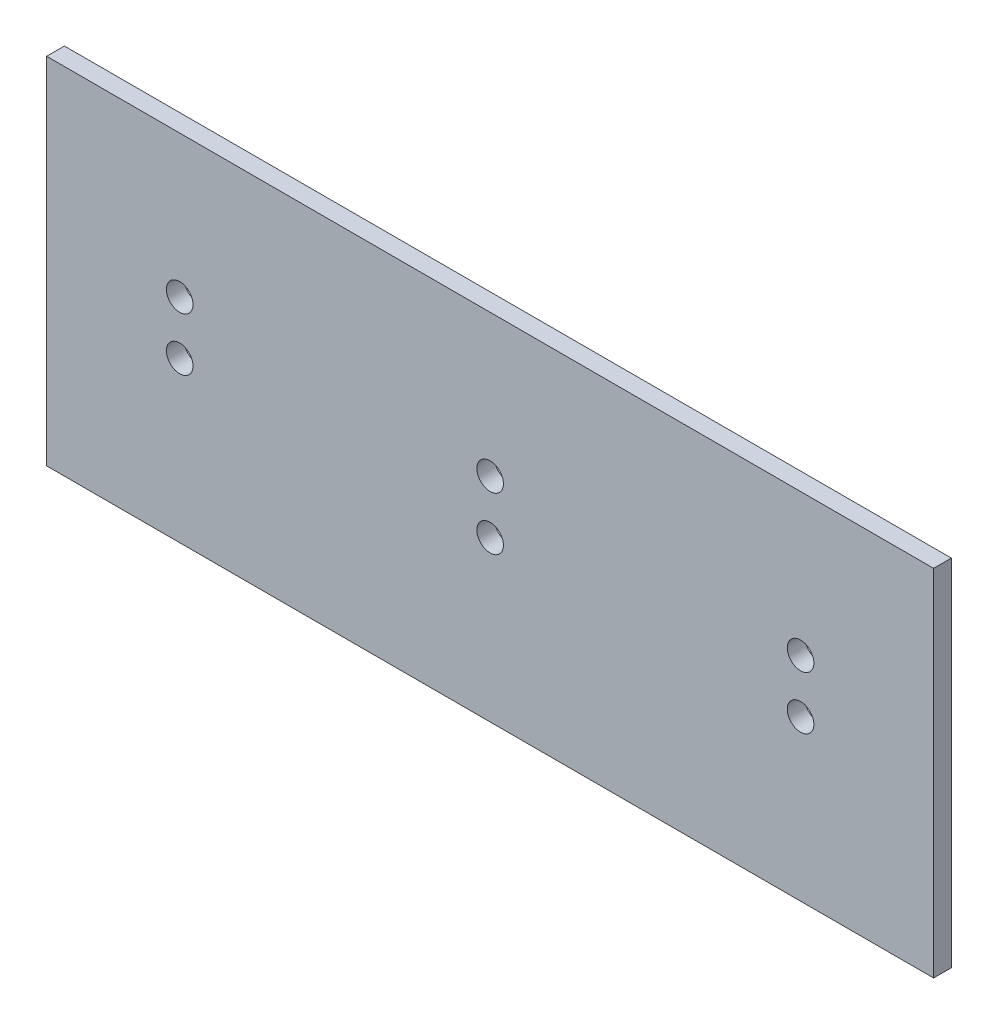
ISO-10303-21;
HEADER;
FILE_DESCRIPTION(('STEP AP214'),'2;1');
FILE_NAME('part.step','',(''),(''),'','','');
FILE_SCHEMA(('AUTOMOTIVE_DESIGN { 1 0 10303 214 1 1 1 1 }'));
ENDSEC;
DATA;
#1=APPLICATION_CONTEXT('core data for automotive mechanical design processes');
#2=APPLICATION_PROTOCOL_DEFINITION('international standard','automotive_design',2000,#1);
#3=PRODUCT_CONTEXT('',#1,'mechanical');
#4=PRODUCT('Part','Part','',(#3));
#5=PRODUCT_RELATED_PRODUCT_CATEGORY('part','',(#4));
#6=PRODUCT_DEFINITION_FORMATION('','',#4);
#7=PRODUCT_DEFINITION_CONTEXT('part definition',#1,'design');
#8=PRODUCT_DEFINITION('design','',#6,#7);
#9=PRODUCT_DEFINITION_SHAPE('','',#8);
#10=(LENGTH_UNIT() NAMED_UNIT(*) SI_UNIT(.MILLI.,.METRE.));
#11=(NAMED_UNIT(*) PLANE_ANGLE_UNIT() SI_UNIT($,.RADIAN.));
#12=(NAMED_UNIT(*) SI_UNIT($,.STERADIAN.) SOLID_ANGLE_UNIT());
#13=UNCERTAINTY_MEASURE_WITH_UNIT(LENGTH_MEASURE(1.E-05),#10,'distance_accuracy_value','');
#14=(GEOMETRIC_REPRESENTATION_CONTEXT(3) GLOBAL_UNCERTAINTY_ASSIGNED_CONTEXT((#13)) GLOBAL_UNIT_ASSIGNED_CONTEXT((#10,
#11,#12)) REPRESENTATION_CONTEXT('',''));
#15=CARTESIAN_POINT('',(0.,0.,0.));
#16=DIRECTION('',(0.,0.,1.));
#17=DIRECTION('',(1.,0.,0.));
#18=AXIS2_PLACEMENT_3D('',#15,#16,#17);
#19=CARTESIAN_POINT('',(0.,0.,2.));
#20=DIRECTION('',(0.,0.,1.));
#21=DIRECTION('',(1.,0.,0.));
#22=AXIS2_PLACEMENT_3D('',#19,#20,#21);
#23=PLANE('',#22);
#24=CARTESIAN_POINT('',(35.,-2.,2.));
#25=DIRECTION('',(0.,0.,1.));
#26=DIRECTION('',(-1.,0.,0.));
#27=AXIS2_PLACEMENT_3D('',#24,#25,#26);
#28=CIRCLE('',#27,1.5);
#29=CARTESIAN_POINT('',(33.5,-2.,2.));
#30=VERTEX_POINT('',#29);
#31=EDGE_CURVE('E137',#30,#30,#28,.T.);
#32=ORIENTED_EDGE('',*,*,#31,.F.);
#33=EDGE_LOOP('',(#32));
#34=FACE_BOUND('',#33,.T.);
#35=CARTESIAN_POINT('',(35.,4.,2.));
#36=DIRECTION('',(0.,0.,1.));
#37=DIRECTION('',(-1.,0.,0.));
#38=AXIS2_PLACEMENT_3D('',#35,#36,#37);
#39=CIRCLE('',#38,1.5);
#40=CARTESIAN_POINT('',(33.5,4.,2.));
#41=VERTEX_POINT('',#40);
#42=EDGE_CURVE('E125',#41,#41,#39,.T.);
#43=ORIENTED_EDGE('',*,*,#42,.F.);
#44=EDGE_LOOP('',(#43));
#45=FACE_BOUND('',#44,.T.);
#46=CARTESIAN_POINT('',(-35.,-2.00000000000001,2.));
#47=DIRECTION('',(0.,0.,1.));
#48=DIRECTION('',(1.,0.,0.));
#49=AXIS2_PLACEMENT_3D('',#46,#47,#48);
#50=CIRCLE('',#49,1.5);
#51=CARTESIAN_POINT('',(-33.5,-2.00000000000001,2.));
#52=VERTEX_POINT('',#51);
#53=EDGE_CURVE('E104',#52,#52,#50,.T.);
#54=ORIENTED_EDGE('',*,*,#53,.F.);
#55=EDGE_LOOP('',(#54));
#56=FACE_BOUND('',#55,.T.);
#57=DIRECTION('',(0.,1.,0.));
#58=VECTOR('',#57,1.);
#59=CARTESIAN_POINT('',(50.,20.,2.));
#60=LINE('',#59,#58);
#61=CARTESIAN_POINT('',(50.,-20.,2.));
#62=VERTEX_POINT('',#61);
#63=CARTESIAN_POINT('',(50.,20.,2.));
#64=VERTEX_POINT('',#63);
#65=EDGE_CURVE('E89',#62,#64,#60,.T.);
#66=ORIENTED_EDGE('',*,*,#65,.T.);
#67=DIRECTION('',(-1.,0.,0.));
#68=VECTOR('',#67,1.);
#69=CARTESIAN_POINT('',(-50.,20.,2.));
#70=LINE('',#69,#68);
#71=CARTESIAN_POINT('',(-50.,20.,2.));
#72=VERTEX_POINT('',#71);
#73=EDGE_CURVE('E84',#64,#72,#70,.T.);
#74=ORIENTED_EDGE('',*,*,#73,.T.);
#75=DIRECTION('',(0.,-1.,0.));
#76=VECTOR('',#75,1.);
#77=CARTESIAN_POINT('',(-50.,20.,2.));
#78=LINE('',#77,#76);
#79=CARTESIAN_POINT('',(-50.,-20.,2.));
#80=VERTEX_POINT('',#79);
#81=EDGE_CURVE('E87',#72,#80,#78,.T.);
#82=ORIENTED_EDGE('',*,*,#81,.T.);
#83=DIRECTION('',(1.,0.,0.));
#84=VECTOR('',#83,1.);
#85=CARTESIAN_POINT('',(-50.,-20.,2.));
#86=LINE('',#85,#84);
#87=EDGE_CURVE('E54',#80,#62,#86,.T.);
#88=ORIENTED_EDGE('',*,*,#87,.T.);
#89=EDGE_LOOP('',(#66,#74,#82,#88));
#90=FACE_BOUND('',#89,.T.);
#91=CARTESIAN_POINT('',(0.,4.,2.));
#92=DIRECTION('',(0.,0.,1.));
#93=DIRECTION('',(1.,0.,0.));
#94=AXIS2_PLACEMENT_3D('',#91,#92,#93);
#95=CIRCLE('',#94,1.5);
#96=CARTESIAN_POINT('',(1.5,4.,2.));
#97=VERTEX_POINT('',#96);
#98=EDGE_CURVE('E119',#97,#97,#95,.T.);
#99=ORIENTED_EDGE('',*,*,#98,.F.);
#100=EDGE_LOOP('',(#99));
#101=FACE_BOUND('',#100,.T.);
#102=CARTESIAN_POINT('',(-35.,3.99999999999999,2.));
#103=DIRECTION('',(0.,0.,1.));
#104=DIRECTION('',(1.,0.,0.));
#105=AXIS2_PLACEMENT_3D('',#102,#103,#104);
#106=CIRCLE('',#105,1.5);
#107=CARTESIAN_POINT('',(-33.5,3.99999999999999,2.));
#108=VERTEX_POINT('',#107);
#109=EDGE_CURVE('E131',#108,#108,#106,.T.);
#110=ORIENTED_EDGE('',*,*,#109,.F.);
#111=EDGE_LOOP('',(#110));
#112=FACE_BOUND('',#111,.T.);
#113=CARTESIAN_POINT('',(0.,-2.00000000000001,2.));
#114=DIRECTION('',(0.,0.,1.));
#115=DIRECTION('',(1.,0.,0.));
#116=AXIS2_PLACEMENT_3D('',#113,#114,#115);
#117=CIRCLE('',#116,1.5);
#118=CARTESIAN_POINT('',(1.5,-2.00000000000001,2.));
#119=VERTEX_POINT('',#118);
#120=EDGE_CURVE('E143',#119,#119,#117,.T.);
#121=ORIENTED_EDGE('',*,*,#120,.F.);
#122=EDGE_LOOP('',(#121));
#123=FACE_BOUND('',#122,.T.);
#124=ADVANCED_FACE('F37',(#34,#45,#56,#90,#101,#112,#123),#23,.T.);
#125=CARTESIAN_POINT('',(0.,0.,0.));
#126=DIRECTION('',(0.,0.,1.));
#127=DIRECTION('',(1.,0.,0.));
#128=AXIS2_PLACEMENT_3D('',#125,#126,#127);
#129=PLANE('',#128);
#130=DIRECTION('',(0.,1.,0.));
#131=VECTOR('',#130,1.);
#132=CARTESIAN_POINT('',(50.,20.,0.));
#133=LINE('',#132,#131);
#134=CARTESIAN_POINT('',(50.,-20.,0.));
#135=VERTEX_POINT('',#134);
#136=CARTESIAN_POINT('',(50.,20.,0.));
#137=VERTEX_POINT('',#136);
#138=EDGE_CURVE('E101',#135,#137,#133,.T.);
#139=ORIENTED_EDGE('',*,*,#138,.F.);
#140=DIRECTION('',(1.,0.,0.));
#141=VECTOR('',#140,1.);
#142=CARTESIAN_POINT('',(-50.,-20.,0.));
#143=LINE('',#142,#141);
#144=CARTESIAN_POINT('',(-50.,-20.,0.));
#145=VERTEX_POINT('',#144);
#146=EDGE_CURVE('E77',#145,#135,#143,.T.);
#147=ORIENTED_EDGE('',*,*,#146,.F.);
#148=DIRECTION('',(0.,-1.,0.));
#149=VECTOR('',#148,1.);
#150=CARTESIAN_POINT('',(-50.,20.,0.));
#151=LINE('',#150,#149);
#152=CARTESIAN_POINT('',(-50.,20.,0.));
#153=VERTEX_POINT('',#152);
#154=EDGE_CURVE('E71',#153,#145,#151,.T.);
#155=ORIENTED_EDGE('',*,*,#154,.F.);
#156=DIRECTION('',(-1.,0.,0.));
#157=VECTOR('',#156,1.);
#158=CARTESIAN_POINT('',(-50.,20.,0.));
#159=LINE('',#158,#157);
#160=EDGE_CURVE('E93',#137,#153,#159,.T.);
#161=ORIENTED_EDGE('',*,*,#160,.F.);
#162=EDGE_LOOP('',(#139,#147,#155,#161));
#163=FACE_BOUND('',#162,.T.);
#164=CARTESIAN_POINT('',(-35.,-2.00000000000001,0.));
#165=DIRECTION('',(0.,0.,1.));
#166=DIRECTION('',(1.,0.,0.));
#167=AXIS2_PLACEMENT_3D('',#164,#165,#166);
#168=CIRCLE('',#167,1.5);
#169=CARTESIAN_POINT('',(-33.5,-2.00000000000001,0.));
#170=VERTEX_POINT('',#169);
#171=EDGE_CURVE('E116',#170,#170,#168,.T.);
#172=ORIENTED_EDGE('',*,*,#171,.T.);
#173=EDGE_LOOP('',(#172));
#174=FACE_BOUND('',#173,.T.);
#175=CARTESIAN_POINT('',(0.,4.,0.));
#176=DIRECTION('',(0.,0.,1.));
#177=DIRECTION('',(1.,0.,0.));
#178=AXIS2_PLACEMENT_3D('',#175,#176,#177);
#179=CIRCLE('',#178,1.5);
#180=CARTESIAN_POINT('',(1.5,4.,0.));
#181=VERTEX_POINT('',#180);
#182=EDGE_CURVE('E122',#181,#181,#179,.T.);
#183=ORIENTED_EDGE('',*,*,#182,.T.);
#184=EDGE_LOOP('',(#183));
#185=FACE_BOUND('',#184,.T.);
#186=CARTESIAN_POINT('',(35.,4.,0.));
#187=DIRECTION('',(0.,0.,1.));
#188=DIRECTION('',(-1.,0.,0.));
#189=AXIS2_PLACEMENT_3D('',#186,#187,#188);
#190=CIRCLE('',#189,1.5);
#191=CARTESIAN_POINT('',(33.5,4.,0.));
#192=VERTEX_POINT('',#191);
#193=EDGE_CURVE('E128',#192,#192,#190,.T.);
#194=ORIENTED_EDGE('',*,*,#193,.T.);
#195=EDGE_LOOP('',(#194));
#196=FACE_BOUND('',#195,.T.);
#197=CARTESIAN_POINT('',(-35.,3.99999999999999,0.));
#198=DIRECTION('',(0.,0.,1.));
#199=DIRECTION('',(1.,0.,0.));
#200=AXIS2_PLACEMENT_3D('',#197,#198,#199);
#201=CIRCLE('',#200,1.5);
#202=CARTESIAN_POINT('',(-33.5,3.99999999999999,0.));
#203=VERTEX_POINT('',#202);
#204=EDGE_CURVE('E134',#203,#203,#201,.T.);
#205=ORIENTED_EDGE('',*,*,#204,.T.);
#206=EDGE_LOOP('',(#205));
#207=FACE_BOUND('',#206,.T.);
#208=CARTESIAN_POINT('',(35.,-2.,0.));
#209=DIRECTION('',(0.,0.,1.));
#210=DIRECTION('',(-1.,0.,0.));
#211=AXIS2_PLACEMENT_3D('',#208,#209,#210);
#212=CIRCLE('',#211,1.5);
#213=CARTESIAN_POINT('',(33.5,-2.,0.));
#214=VERTEX_POINT('',#213);
#215=EDGE_CURVE('E140',#214,#214,#212,.T.);
#216=ORIENTED_EDGE('',*,*,#215,.T.);
#217=EDGE_LOOP('',(#216));
#218=FACE_BOUND('',#217,.T.);
#219=CARTESIAN_POINT('',(0.,-2.00000000000001,0.));
#220=DIRECTION('',(0.,0.,1.));
#221=DIRECTION('',(1.,0.,0.));
#222=AXIS2_PLACEMENT_3D('',#219,#220,#221);
#223=CIRCLE('',#222,1.5);
#224=CARTESIAN_POINT('',(1.5,-2.00000000000001,0.));
#225=VERTEX_POINT('',#224);
#226=EDGE_CURVE('E146',#225,#225,#223,.T.);
#227=ORIENTED_EDGE('',*,*,#226,.T.);
#228=EDGE_LOOP('',(#227));
#229=FACE_BOUND('',#228,.T.);
#230=ADVANCED_FACE('F112',(#163,#174,#185,#196,#207,#218,#229),#129,.F.);
#231=CARTESIAN_POINT('',(50.,20.,2.));
#232=DIRECTION('',(-1.,0.,0.));
#233=DIRECTION('',(0.,0.,1.));
#234=AXIS2_PLACEMENT_3D('',#231,#232,#233);
#235=PLANE('',#234);
#236=ORIENTED_EDGE('',*,*,#138,.T.);
#237=DIRECTION('',(0.,0.,-1.));
#238=VECTOR('',#237,1.);
#239=CARTESIAN_POINT('',(50.,20.,2.));
#240=LINE('',#239,#238);
#241=EDGE_CURVE('E11',#64,#137,#240,.T.);
#242=ORIENTED_EDGE('',*,*,#241,.F.);
#243=ORIENTED_EDGE('',*,*,#65,.F.);
#244=DIRECTION('',(0.,0.,-1.));
#245=VECTOR('',#244,1.);
#246=CARTESIAN_POINT('',(50.,-20.,2.));
#247=LINE('',#246,#245);
#248=EDGE_CURVE('E97',#62,#135,#247,.T.);
#249=ORIENTED_EDGE('',*,*,#248,.T.);
#250=EDGE_LOOP('',(#236,#242,#243,#249));
#251=FACE_BOUND('',#250,.T.);
#252=ADVANCED_FACE('F39',(#251),#235,.F.);
#253=CARTESIAN_POINT('',(-50.,20.,2.));
#254=DIRECTION('',(0.,-1.,0.));
#255=DIRECTION('',(0.,0.,-1.));
#256=AXIS2_PLACEMENT_3D('',#253,#254,#255);
#257=PLANE('',#256);
#258=ORIENTED_EDGE('',*,*,#160,.T.);
#259=DIRECTION('',(0.,0.,-1.));
#260=VECTOR('',#259,1.);
#261=CARTESIAN_POINT('',(-50.,20.,2.));
#262=LINE('',#261,#260);
#263=EDGE_CURVE('E46',#72,#153,#262,.T.);
#264=ORIENTED_EDGE('',*,*,#263,.F.);
#265=ORIENTED_EDGE('',*,*,#73,.F.);
#266=ORIENTED_EDGE('',*,*,#241,.T.);
#267=EDGE_LOOP('',(#258,#264,#265,#266));
#268=FACE_BOUND('',#267,.T.);
#269=ADVANCED_FACE('F92',(#268),#257,.F.);
#270=CARTESIAN_POINT('',(-50.,20.,2.));
#271=DIRECTION('',(1.,0.,0.));
#272=DIRECTION('',(0.,1.,0.));
#273=AXIS2_PLACEMENT_3D('',#270,#271,#272);
#274=PLANE('',#273);
#275=ORIENTED_EDGE('',*,*,#154,.T.);
#276=DIRECTION('',(0.,0.,-1.));
#277=VECTOR('',#276,1.);
#278=CARTESIAN_POINT('',(-50.,-20.,2.));
#279=LINE('',#278,#277);
#280=EDGE_CURVE('E94',#80,#145,#279,.T.);
#281=ORIENTED_EDGE('',*,*,#280,.F.);
#282=ORIENTED_EDGE('',*,*,#81,.F.);
#283=ORIENTED_EDGE('',*,*,#263,.T.);
#284=EDGE_LOOP('',(#275,#281,#282,#283));
#285=FACE_BOUND('',#284,.T.);
#286=ADVANCED_FACE('F95',(#285),#274,.F.);
#287=CARTESIAN_POINT('',(-50.,-20.,2.));
#288=DIRECTION('',(0.,1.,0.));
#289=DIRECTION('',(0.,0.,1.));
#290=AXIS2_PLACEMENT_3D('',#287,#288,#289);
#291=PLANE('',#290);
#292=ORIENTED_EDGE('',*,*,#146,.T.);
#293=ORIENTED_EDGE('',*,*,#248,.F.);
#294=ORIENTED_EDGE('',*,*,#87,.F.);
#295=ORIENTED_EDGE('',*,*,#280,.T.);
#296=EDGE_LOOP('',(#292,#293,#294,#295));
#297=FACE_BOUND('',#296,.T.);
#298=ADVANCED_FACE('F109',(#297),#291,.F.);
#299=CARTESIAN_POINT('',(-35.,-2.00000000000001,2.));
#300=DIRECTION('',(0.,0.,-1.));
#301=DIRECTION('',(-1.,0.,0.));
#302=AXIS2_PLACEMENT_3D('',#299,#300,#301);
#303=CYLINDRICAL_SURFACE('',#302,1.5);
#304=ORIENTED_EDGE('',*,*,#53,.T.);
#305=EDGE_LOOP('',(#304));
#306=FACE_BOUND('',#305,.T.);
#307=ORIENTED_EDGE('',*,*,#171,.F.);
#308=EDGE_LOOP('',(#307));
#309=FACE_BOUND('',#308,.T.);
#310=ADVANCED_FACE('F165',(#306,#309),#303,.F.);
#311=CARTESIAN_POINT('',(0.,4.,2.));
#312=DIRECTION('',(0.,0.,-1.));
#313=DIRECTION('',(-1.,0.,0.));
#314=AXIS2_PLACEMENT_3D('',#311,#312,#313);
#315=CYLINDRICAL_SURFACE('',#314,1.5);
#316=ORIENTED_EDGE('',*,*,#98,.T.);
#317=EDGE_LOOP('',(#316));
#318=FACE_BOUND('',#317,.T.);
#319=ORIENTED_EDGE('',*,*,#182,.F.);
#320=EDGE_LOOP('',(#319));
#321=FACE_BOUND('',#320,.T.);
#322=ADVANCED_FACE('F219',(#318,#321),#315,.F.);
#323=CARTESIAN_POINT('',(35.,4.,2.));
#324=DIRECTION('',(0.,0.,-1.));
#325=DIRECTION('',(-1.,0.,0.));
#326=AXIS2_PLACEMENT_3D('',#323,#324,#325);
#327=CYLINDRICAL_SURFACE('',#326,1.5);
#328=ORIENTED_EDGE('',*,*,#42,.T.);
#329=EDGE_LOOP('',(#328));
#330=FACE_BOUND('',#329,.T.);
#331=ORIENTED_EDGE('',*,*,#193,.F.);
#332=EDGE_LOOP('',(#331));
#333=FACE_BOUND('',#332,.T.);
#334=ADVANCED_FACE('F228',(#330,#333),#327,.F.);
#335=CARTESIAN_POINT('',(-35.,3.99999999999999,2.));
#336=DIRECTION('',(0.,0.,-1.));
#337=DIRECTION('',(-1.,0.,0.));
#338=AXIS2_PLACEMENT_3D('',#335,#336,#337);
#339=CYLINDRICAL_SURFACE('',#338,1.5);
#340=ORIENTED_EDGE('',*,*,#109,.T.);
#341=EDGE_LOOP('',(#340));
#342=FACE_BOUND('',#341,.T.);
#343=ORIENTED_EDGE('',*,*,#204,.F.);
#344=EDGE_LOOP('',(#343));
#345=FACE_BOUND('',#344,.T.);
#346=ADVANCED_FACE('F237',(#342,#345),#339,.F.);
#347=CARTESIAN_POINT('',(35.,-2.,2.));
#348=DIRECTION('',(0.,0.,-1.));
#349=DIRECTION('',(-1.,0.,0.));
#350=AXIS2_PLACEMENT_3D('',#347,#348,#349);
#351=CYLINDRICAL_SURFACE('',#350,1.5);
#352=ORIENTED_EDGE('',*,*,#31,.T.);
#353=EDGE_LOOP('',(#352));
#354=FACE_BOUND('',#353,.T.);
#355=ORIENTED_EDGE('',*,*,#215,.F.);
#356=EDGE_LOOP('',(#355));
#357=FACE_BOUND('',#356,.T.);
#358=ADVANCED_FACE('F247',(#354,#357),#351,.F.);
#359=CARTESIAN_POINT('',(0.,-2.00000000000001,2.));
#360=DIRECTION('',(0.,0.,-1.));
#361=DIRECTION('',(-1.,0.,0.));
#362=AXIS2_PLACEMENT_3D('',#359,#360,#361);
#363=CYLINDRICAL_SURFACE('',#362,1.5);
#364=ORIENTED_EDGE('',*,*,#120,.T.);
#365=EDGE_LOOP('',(#364));
#366=FACE_BOUND('',#365,.T.);
#367=ORIENTED_EDGE('',*,*,#226,.F.);
#368=EDGE_LOOP('',(#367));
#369=FACE_BOUND('',#368,.T.);
#370=ADVANCED_FACE('F152',(#366,#369),#363,.F.);
#371=CLOSED_SHELL('',(#124,#230,#252,#269,#286,#298,#310,#322,#334,#346,#358,#370));
#372=MANIFOLD_SOLID_BREP('B2',#371);
#373=ADVANCED_BREP_SHAPE_REPRESENTATION('',(#18,#372),#14);
#374=SHAPE_DEFINITION_REPRESENTATION(#9,#373);
ENDSEC;
END-ISO-10303-21;
